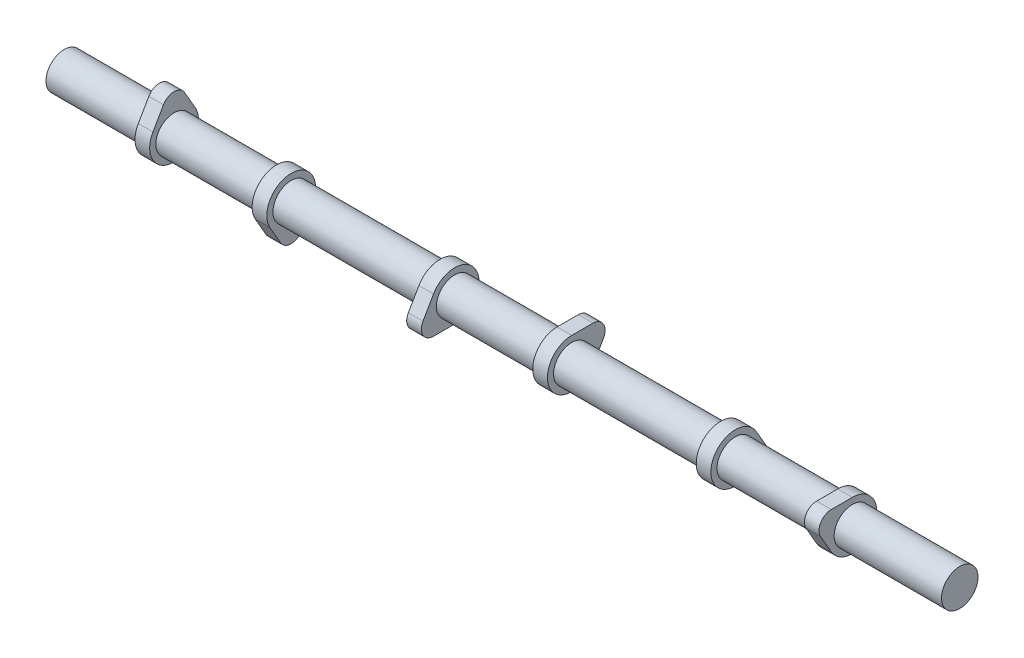
ISO-10303-21;
HEADER;
FILE_DESCRIPTION(('STEP AP214'),'2;1');
FILE_NAME('part.step','',(''),(''),'','','');
FILE_SCHEMA(('AUTOMOTIVE_DESIGN { 1 0 10303 214 1 1 1 1 }'));
ENDSEC;
DATA;
#1=APPLICATION_CONTEXT('core data for automotive mechanical design processes');
#2=APPLICATION_PROTOCOL_DEFINITION('international standard','automotive_design',2000,#1);
#3=PRODUCT_CONTEXT('',#1,'mechanical');
#4=PRODUCT('Part','Part','',(#3));
#5=PRODUCT_RELATED_PRODUCT_CATEGORY('part','',(#4));
#6=PRODUCT_DEFINITION_FORMATION('','',#4);
#7=PRODUCT_DEFINITION_CONTEXT('part definition',#1,'design');
#8=PRODUCT_DEFINITION('design','',#6,#7);
#9=PRODUCT_DEFINITION_SHAPE('','',#8);
#10=(LENGTH_UNIT() NAMED_UNIT(*) SI_UNIT(.MILLI.,.METRE.));
#11=(NAMED_UNIT(*) PLANE_ANGLE_UNIT() SI_UNIT($,.RADIAN.));
#12=(NAMED_UNIT(*) SI_UNIT($,.STERADIAN.) SOLID_ANGLE_UNIT());
#13=UNCERTAINTY_MEASURE_WITH_UNIT(LENGTH_MEASURE(1.E-05),#10,'distance_accuracy_value','');
#14=(GEOMETRIC_REPRESENTATION_CONTEXT(3) GLOBAL_UNCERTAINTY_ASSIGNED_CONTEXT((#13)) GLOBAL_UNIT_ASSIGNED_CONTEXT((#10,
#11,#12)) REPRESENTATION_CONTEXT('',''));
#15=CARTESIAN_POINT('',(0.,0.,0.));
#16=DIRECTION('',(0.,0.,1.));
#17=DIRECTION('',(1.,0.,0.));
#18=AXIS2_PLACEMENT_3D('',#15,#16,#17);
#19=CARTESIAN_POINT('',(266.7,0.,0.));
#20=DIRECTION('',(-1.,0.,0.));
#21=DIRECTION('',(0.,-0.866025403784436,-0.500000000000004));
#22=AXIS2_PLACEMENT_3D('',#19,#20,#21);
#23=CYLINDRICAL_SURFACE('',#22,9.5);
#24=CARTESIAN_POINT('',(149.86,0.,0.));
#25=DIRECTION('',(1.,0.,0.));
#26=DIRECTION('',(0.,0.866025403784436,0.500000000000004));
#27=AXIS2_PLACEMENT_3D('',#24,#25,#26);
#28=CIRCLE('',#27,9.5);
#29=CARTESIAN_POINT('',(149.86,8.22724133595215,4.75000000000004));
#30=VERTEX_POINT('',#29);
#31=EDGE_CURVE('E394',#30,#30,#28,.F.);
#32=ORIENTED_EDGE('',*,*,#31,.F.);
#33=EDGE_LOOP('',(#32));
#34=FACE_BOUND('',#33,.T.);
#35=CARTESIAN_POINT('',(203.2,0.,0.));
#36=DIRECTION('',(1.,0.,0.));
#37=DIRECTION('',(0.,0.866025403784436,0.500000000000004));
#38=AXIS2_PLACEMENT_3D('',#35,#36,#37);
#39=CIRCLE('',#38,9.5);
#40=CARTESIAN_POINT('',(203.2,8.22724133595215,4.75000000000004));
#41=VERTEX_POINT('',#40);
#42=EDGE_CURVE('E11',#41,#41,#39,.T.);
#43=ORIENTED_EDGE('',*,*,#42,.F.);
#44=EDGE_LOOP('',(#43));
#45=FACE_BOUND('',#44,.T.);
#46=ADVANCED_FACE('F41',(#34,#45),#23,.T.);
#47=CARTESIAN_POINT('',(149.86,0.,0.));
#48=DIRECTION('',(-1.,0.,0.));
#49=DIRECTION('',(0.,-0.866025403784436,-0.500000000000004));
#50=AXIS2_PLACEMENT_3D('',#47,#48,#49);
#51=CYLINDRICAL_SURFACE('',#50,12.7);
#52=CARTESIAN_POINT('',(142.24,0.,0.));
#53=DIRECTION('',(1.,0.,0.));
#54=DIRECTION('',(0.,0.866025403784436,0.500000000000004));
#55=AXIS2_PLACEMENT_3D('',#52,#53,#54);
#56=CIRCLE('',#55,12.7);
#57=CARTESIAN_POINT('',(142.24,-12.7,0.));
#58=VERTEX_POINT('',#57);
#59=CARTESIAN_POINT('',(142.24,6.34999999999995,10.9985226280624));
#60=VERTEX_POINT('',#59);
#61=EDGE_CURVE('E397',#58,#60,#56,.T.);
#62=ORIENTED_EDGE('',*,*,#61,.T.);
#63=DIRECTION('',(-1.,0.,0.));
#64=VECTOR('',#63,1.);
#65=CARTESIAN_POINT('',(149.86,6.34999999999995,10.9985226280624));
#66=LINE('',#65,#64);
#67=CARTESIAN_POINT('',(149.86,6.34999999999995,10.9985226280624));
#68=VERTEX_POINT('',#67);
#69=EDGE_CURVE('E416',#68,#60,#66,.T.);
#70=ORIENTED_EDGE('',*,*,#69,.F.);
#71=CARTESIAN_POINT('',(149.86,0.,0.));
#72=DIRECTION('',(1.,0.,0.));
#73=DIRECTION('',(0.,0.866025403784436,0.500000000000004));
#74=AXIS2_PLACEMENT_3D('',#71,#72,#73);
#75=CIRCLE('',#74,12.7);
#76=CARTESIAN_POINT('',(149.86,-12.7,0.));
#77=VERTEX_POINT('',#76);
#78=EDGE_CURVE('E398',#77,#68,#75,.T.);
#79=ORIENTED_EDGE('',*,*,#78,.F.);
#80=DIRECTION('',(-1.,0.,0.));
#81=VECTOR('',#80,1.);
#82=CARTESIAN_POINT('',(149.86,-12.7,0.));
#83=LINE('',#82,#81);
#84=EDGE_CURVE('E404',#77,#58,#83,.T.);
#85=ORIENTED_EDGE('',*,*,#84,.T.);
#86=EDGE_LOOP('',(#62,#70,#79,#85));
#87=FACE_BOUND('',#86,.T.);
#88=ADVANCED_FACE('F43',(#87),#51,.T.);
#89=CARTESIAN_POINT('',(149.86,-3.17500000000008,16.4977839420935));
#90=DIRECTION('',(0.,-0.499999999999996,-0.866025403784441));
#91=DIRECTION('',(0.,0.866025403784441,-0.499999999999996));
#92=AXIS2_PLACEMENT_3D('',#89,#90,#91);
#93=PLANE('',#92);
#94=DIRECTION('',(0.,-0.866025403784441,0.499999999999996));
#95=VECTOR('',#94,1.);
#96=CARTESIAN_POINT('',(142.24,-3.17500000000008,16.4977839420935));
#97=LINE('',#96,#95);
#98=CARTESIAN_POINT('',(142.24,-3.17500000000008,16.4977839420935));
#99=VERTEX_POINT('',#98);
#100=EDGE_CURVE('E407',#60,#99,#97,.T.);
#101=ORIENTED_EDGE('',*,*,#100,.T.);
#102=DIRECTION('',(-1.,0.,0.));
#103=VECTOR('',#102,1.);
#104=CARTESIAN_POINT('',(149.86,-3.17500000000008,16.4977839420935));
#105=LINE('',#104,#103);
#106=CARTESIAN_POINT('',(149.86,-3.17500000000008,16.4977839420935));
#107=VERTEX_POINT('',#106);
#108=EDGE_CURVE('E414',#107,#99,#105,.T.);
#109=ORIENTED_EDGE('',*,*,#108,.F.);
#110=DIRECTION('',(0.,-0.866025403784441,0.499999999999996));
#111=VECTOR('',#110,1.);
#112=CARTESIAN_POINT('',(149.86,-3.17500000000008,16.4977839420935));
#113=LINE('',#112,#111);
#114=EDGE_CURVE('E91',#68,#107,#113,.T.);
#115=ORIENTED_EDGE('',*,*,#114,.F.);
#116=ORIENTED_EDGE('',*,*,#69,.T.);
#117=EDGE_LOOP('',(#101,#109,#115,#116));
#118=FACE_BOUND('',#117,.T.);
#119=ADVANCED_FACE('F436',(#118),#93,.F.);
#120=CARTESIAN_POINT('',(149.86,-6.35000000000005,10.9985226280623));
#121=DIRECTION('',(-1.,0.,0.));
#122=DIRECTION('',(0.,-0.866025403784436,-0.500000000000004));
#123=AXIS2_PLACEMENT_3D('',#120,#121,#122);
#124=CYLINDRICAL_SURFACE('',#123,6.35);
#125=CARTESIAN_POINT('',(142.24,-6.35000000000005,10.9985226280623));
#126=DIRECTION('',(1.,0.,0.));
#127=DIRECTION('',(0.,0.866025403784436,0.500000000000004));
#128=AXIS2_PLACEMENT_3D('',#125,#126,#127);
#129=CIRCLE('',#128,6.35);
#130=CARTESIAN_POINT('',(142.24,-12.7000000000001,10.9985226280623));
#131=VERTEX_POINT('',#130);
#132=EDGE_CURVE('E77',#99,#131,#129,.T.);
#133=ORIENTED_EDGE('',*,*,#132,.T.);
#134=DIRECTION('',(-1.,0.,0.));
#135=VECTOR('',#134,1.);
#136=CARTESIAN_POINT('',(149.86,-12.7000000000001,10.9985226280623));
#137=LINE('',#136,#135);
#138=CARTESIAN_POINT('',(149.86,-12.7000000000001,10.9985226280623));
#139=VERTEX_POINT('',#138);
#140=EDGE_CURVE('E412',#139,#131,#137,.T.);
#141=ORIENTED_EDGE('',*,*,#140,.F.);
#142=CARTESIAN_POINT('',(149.86,-6.35000000000005,10.9985226280623));
#143=DIRECTION('',(1.,0.,0.));
#144=DIRECTION('',(0.,0.866025403784436,0.500000000000004));
#145=AXIS2_PLACEMENT_3D('',#142,#143,#144);
#146=CIRCLE('',#145,6.35);
#147=EDGE_CURVE('E401',#107,#139,#146,.T.);
#148=ORIENTED_EDGE('',*,*,#147,.F.);
#149=ORIENTED_EDGE('',*,*,#108,.T.);
#150=EDGE_LOOP('',(#133,#141,#148,#149));
#151=FACE_BOUND('',#150,.T.);
#152=ADVANCED_FACE('F435',(#151),#124,.T.);
#153=CARTESIAN_POINT('',(149.86,-12.7,0.));
#154=DIRECTION('',(0.,1.,0.));
#155=DIRECTION('',(0.,0.,1.));
#156=AXIS2_PLACEMENT_3D('',#153,#154,#155);
#157=PLANE('',#156);
#158=DIRECTION('',(0.,0.,-1.));
#159=VECTOR('',#158,1.);
#160=CARTESIAN_POINT('',(142.24,-12.7,0.));
#161=LINE('',#160,#159);
#162=EDGE_CURVE('E83',#131,#58,#161,.T.);
#163=ORIENTED_EDGE('',*,*,#162,.T.);
#164=ORIENTED_EDGE('',*,*,#84,.F.);
#165=DIRECTION('',(0.,0.,-1.));
#166=VECTOR('',#165,1.);
#167=CARTESIAN_POINT('',(149.86,-12.7,0.));
#168=LINE('',#167,#166);
#169=EDGE_CURVE('E59',#139,#77,#168,.T.);
#170=ORIENTED_EDGE('',*,*,#169,.F.);
#171=ORIENTED_EDGE('',*,*,#140,.T.);
#172=EDGE_LOOP('',(#163,#164,#170,#171));
#173=FACE_BOUND('',#172,.T.);
#174=ADVANCED_FACE('F433',(#173),#157,.F.);
#175=CARTESIAN_POINT('',(149.86,0.,0.));
#176=DIRECTION('',(1.,0.,0.));
#177=DIRECTION('',(0.,0.866025403784436,0.500000000000004));
#178=AXIS2_PLACEMENT_3D('',#175,#176,#177);
#179=PLANE('',#178);
#180=ORIENTED_EDGE('',*,*,#31,.T.);
#181=EDGE_LOOP('',(#180));
#182=FACE_BOUND('',#181,.T.);
#183=ORIENTED_EDGE('',*,*,#78,.T.);
#184=ORIENTED_EDGE('',*,*,#114,.T.);
#185=ORIENTED_EDGE('',*,*,#147,.T.);
#186=ORIENTED_EDGE('',*,*,#169,.T.);
#187=EDGE_LOOP('',(#183,#184,#185,#186));
#188=FACE_BOUND('',#187,.T.);
#189=ADVANCED_FACE('F427',(#182,#188),#179,.T.);
#190=CARTESIAN_POINT('',(142.24,0.,0.));
#191=DIRECTION('',(1.,0.,0.));
#192=DIRECTION('',(0.,0.866025403784436,0.500000000000004));
#193=AXIS2_PLACEMENT_3D('',#190,#191,#192);
#194=PLANE('',#193);
#195=CARTESIAN_POINT('',(142.24,0.,0.));
#196=DIRECTION('',(1.,0.,0.));
#197=DIRECTION('',(0.,0.866025403784436,0.500000000000004));
#198=AXIS2_PLACEMENT_3D('',#195,#196,#197);
#199=CIRCLE('',#198,9.5);
#200=CARTESIAN_POINT('',(142.24,8.22724133595215,4.75000000000004));
#201=VERTEX_POINT('',#200);
#202=EDGE_CURVE('E51',#201,#201,#199,.F.);
#203=ORIENTED_EDGE('',*,*,#202,.F.);
#204=EDGE_LOOP('',(#203));
#205=FACE_BOUND('',#204,.T.);
#206=ORIENTED_EDGE('',*,*,#61,.F.);
#207=ORIENTED_EDGE('',*,*,#162,.F.);
#208=ORIENTED_EDGE('',*,*,#132,.F.);
#209=ORIENTED_EDGE('',*,*,#100,.F.);
#210=EDGE_LOOP('',(#206,#207,#208,#209));
#211=FACE_BOUND('',#210,.T.);
#212=ADVANCED_FACE('F424',(#205,#211),#194,.F.);
#213=ORIENTED_EDGE('',*,*,#202,.T.);
#214=EDGE_LOOP('',(#213));
#215=FACE_BOUND('',#214,.T.);
#216=CARTESIAN_POINT('',(64.77,0.,0.));
#217=DIRECTION('',(1.,0.,0.));
#218=DIRECTION('',(0.,0.,-1.));
#219=AXIS2_PLACEMENT_3D('',#216,#217,#218);
#220=CIRCLE('',#219,9.5);
#221=CARTESIAN_POINT('',(64.77,0.,-9.5));
#222=VERTEX_POINT('',#221);
#223=EDGE_CURVE('E322',#222,#222,#220,.T.);
#224=ORIENTED_EDGE('',*,*,#223,.T.);
#225=EDGE_LOOP('',(#224));
#226=FACE_BOUND('',#225,.T.);
#227=ADVANCED_FACE('F421',(#215,#226),#23,.T.);
#228=CARTESIAN_POINT('',(210.82,0.,0.));
#229=DIRECTION('',(-1.,0.,0.));
#230=DIRECTION('',(0.,0.86602540378444,0.499999999999998));
#231=AXIS2_PLACEMENT_3D('',#228,#229,#230);
#232=CYLINDRICAL_SURFACE('',#231,12.7);
#233=CARTESIAN_POINT('',(203.2,0.,0.));
#234=DIRECTION('',(1.,0.,0.));
#235=DIRECTION('',(0.,-0.86602540378444,-0.499999999999998));
#236=AXIS2_PLACEMENT_3D('',#233,#234,#235);
#237=CIRCLE('',#236,12.7);
#238=CARTESIAN_POINT('',(203.2,12.7,0.));
#239=VERTEX_POINT('',#238);
#240=CARTESIAN_POINT('',(203.2,-6.35000000000003,-10.9985226280624));
#241=VERTEX_POINT('',#240);
#242=EDGE_CURVE('E362',#239,#241,#237,.T.);
#243=ORIENTED_EDGE('',*,*,#242,.T.);
#244=DIRECTION('',(-1.,0.,0.));
#245=VECTOR('',#244,1.);
#246=CARTESIAN_POINT('',(210.82,-6.35000000000003,-10.9985226280624));
#247=LINE('',#246,#245);
#248=CARTESIAN_POINT('',(210.82,-6.35000000000003,-10.9985226280624));
#249=VERTEX_POINT('',#248);
#250=EDGE_CURVE('E391',#249,#241,#247,.T.);
#251=ORIENTED_EDGE('',*,*,#250,.F.);
#252=CARTESIAN_POINT('',(210.82,0.,0.));
#253=DIRECTION('',(1.,0.,0.));
#254=DIRECTION('',(0.,-0.86602540378444,-0.499999999999998));
#255=AXIS2_PLACEMENT_3D('',#252,#253,#254);
#256=CIRCLE('',#255,12.7);
#257=CARTESIAN_POINT('',(210.82,12.7,0.));
#258=VERTEX_POINT('',#257);
#259=EDGE_CURVE('E365',#258,#249,#256,.T.);
#260=ORIENTED_EDGE('',*,*,#259,.F.);
#261=DIRECTION('',(-1.,0.,0.));
#262=VECTOR('',#261,1.);
#263=CARTESIAN_POINT('',(210.82,12.7,0.));
#264=LINE('',#263,#262);
#265=EDGE_CURVE('E375',#258,#239,#264,.T.);
#266=ORIENTED_EDGE('',*,*,#265,.T.);
#267=EDGE_LOOP('',(#243,#251,#260,#266));
#268=FACE_BOUND('',#267,.T.);
#269=ADVANCED_FACE('F454',(#268),#232,.T.);
#270=CARTESIAN_POINT('',(210.82,3.17499999999996,-16.4977839420936));
#271=DIRECTION('',(0.,0.500000000000002,0.866025403784438));
#272=DIRECTION('',(0.,-0.866025403784438,0.500000000000002));
#273=AXIS2_PLACEMENT_3D('',#270,#271,#272);
#274=PLANE('',#273);
#275=DIRECTION('',(0.,0.866025403784438,-0.500000000000002));
#276=VECTOR('',#275,1.);
#277=CARTESIAN_POINT('',(203.2,3.17499999999996,-16.4977839420936));
#278=LINE('',#277,#276);
#279=CARTESIAN_POINT('',(203.2,3.17499999999996,-16.4977839420936));
#280=VERTEX_POINT('',#279);
#281=EDGE_CURVE('E378',#241,#280,#278,.T.);
#282=ORIENTED_EDGE('',*,*,#281,.T.);
#283=DIRECTION('',(-1.,0.,0.));
#284=VECTOR('',#283,1.);
#285=CARTESIAN_POINT('',(210.82,3.17499999999996,-16.4977839420936));
#286=LINE('',#285,#284);
#287=CARTESIAN_POINT('',(210.82,3.17499999999996,-16.4977839420936));
#288=VERTEX_POINT('',#287);
#289=EDGE_CURVE('E388',#288,#280,#286,.T.);
#290=ORIENTED_EDGE('',*,*,#289,.F.);
#291=DIRECTION('',(0.,0.866025403784438,-0.500000000000002));
#292=VECTOR('',#291,1.);
#293=CARTESIAN_POINT('',(210.82,3.17499999999996,-16.4977839420936));
#294=LINE('',#293,#292);
#295=EDGE_CURVE('E368',#249,#288,#294,.T.);
#296=ORIENTED_EDGE('',*,*,#295,.F.);
#297=ORIENTED_EDGE('',*,*,#250,.T.);
#298=EDGE_LOOP('',(#282,#290,#296,#297));
#299=FACE_BOUND('',#298,.T.);
#300=ADVANCED_FACE('F578',(#299),#274,.F.);
#301=CARTESIAN_POINT('',(210.82,6.34999999999997,-10.9985226280624));
#302=DIRECTION('',(-1.,0.,0.));
#303=DIRECTION('',(0.,0.86602540378444,0.499999999999998));
#304=AXIS2_PLACEMENT_3D('',#301,#302,#303);
#305=CYLINDRICAL_SURFACE('',#304,6.35);
#306=CARTESIAN_POINT('',(203.2,6.34999999999997,-10.9985226280624));
#307=DIRECTION('',(1.,0.,0.));
#308=DIRECTION('',(0.,-0.86602540378444,-0.499999999999998));
#309=AXIS2_PLACEMENT_3D('',#306,#307,#308);
#310=CIRCLE('',#309,6.35);
#311=CARTESIAN_POINT('',(203.2,12.7,-10.9985226280624));
#312=VERTEX_POINT('',#311);
#313=EDGE_CURVE('E380',#280,#312,#310,.T.);
#314=ORIENTED_EDGE('',*,*,#313,.T.);
#315=DIRECTION('',(-1.,0.,0.));
#316=VECTOR('',#315,1.);
#317=CARTESIAN_POINT('',(210.82,12.7,-10.9985226280624));
#318=LINE('',#317,#316);
#319=CARTESIAN_POINT('',(210.82,12.7,-10.9985226280624));
#320=VERTEX_POINT('',#319);
#321=EDGE_CURVE('E385',#320,#312,#318,.T.);
#322=ORIENTED_EDGE('',*,*,#321,.F.);
#323=CARTESIAN_POINT('',(210.82,6.34999999999997,-10.9985226280624));
#324=DIRECTION('',(1.,0.,0.));
#325=DIRECTION('',(0.,-0.86602540378444,-0.499999999999998));
#326=AXIS2_PLACEMENT_3D('',#323,#324,#325);
#327=CIRCLE('',#326,6.35);
#328=EDGE_CURVE('E371',#288,#320,#327,.T.);
#329=ORIENTED_EDGE('',*,*,#328,.F.);
#330=ORIENTED_EDGE('',*,*,#289,.T.);
#331=EDGE_LOOP('',(#314,#322,#329,#330));
#332=FACE_BOUND('',#331,.T.);
#333=ADVANCED_FACE('F574',(#332),#305,.T.);
#334=CARTESIAN_POINT('',(210.82,12.7,0.));
#335=DIRECTION('',(0.,-1.,0.));
#336=DIRECTION('',(0.,0.,-1.));
#337=AXIS2_PLACEMENT_3D('',#334,#335,#336);
#338=PLANE('',#337);
#339=DIRECTION('',(0.,0.,1.));
#340=VECTOR('',#339,1.);
#341=CARTESIAN_POINT('',(203.2,12.7,0.));
#342=LINE('',#341,#340);
#343=EDGE_CURVE('E369',#312,#239,#342,.T.);
#344=ORIENTED_EDGE('',*,*,#343,.T.);
#345=ORIENTED_EDGE('',*,*,#265,.F.);
#346=DIRECTION('',(0.,0.,1.));
#347=VECTOR('',#346,1.);
#348=CARTESIAN_POINT('',(210.82,12.7,0.));
#349=LINE('',#348,#347);
#350=EDGE_CURVE('E373',#320,#258,#349,.T.);
#351=ORIENTED_EDGE('',*,*,#350,.F.);
#352=ORIENTED_EDGE('',*,*,#321,.T.);
#353=EDGE_LOOP('',(#344,#345,#351,#352));
#354=FACE_BOUND('',#353,.T.);
#355=ADVANCED_FACE('F569',(#354),#338,.F.);
#356=CARTESIAN_POINT('',(210.82,0.,0.));
#357=DIRECTION('',(1.,0.,0.));
#358=DIRECTION('',(0.,-0.86602540378444,-0.499999999999998));
#359=AXIS2_PLACEMENT_3D('',#356,#357,#358);
#360=PLANE('',#359);
#361=CARTESIAN_POINT('',(210.82,0.,0.));
#362=DIRECTION('',(1.,0.,0.));
#363=DIRECTION('',(0.,0.866025403784436,0.500000000000004));
#364=AXIS2_PLACEMENT_3D('',#361,#362,#363);
#365=CIRCLE('',#364,9.5);
#366=CARTESIAN_POINT('',(210.82,8.22724133595215,4.75000000000004));
#367=VERTEX_POINT('',#366);
#368=EDGE_CURVE('E45',#367,#367,#365,.T.);
#369=ORIENTED_EDGE('',*,*,#368,.F.);
#370=EDGE_LOOP('',(#369));
#371=FACE_BOUND('',#370,.T.);
#372=ORIENTED_EDGE('',*,*,#259,.T.);
#373=ORIENTED_EDGE('',*,*,#295,.T.);
#374=ORIENTED_EDGE('',*,*,#328,.T.);
#375=ORIENTED_EDGE('',*,*,#350,.T.);
#376=EDGE_LOOP('',(#372,#373,#374,#375));
#377=FACE_BOUND('',#376,.T.);
#378=ADVANCED_FACE('F467',(#371,#377),#360,.T.);
#379=CARTESIAN_POINT('',(203.2,0.,0.));
#380=DIRECTION('',(1.,0.,0.));
#381=DIRECTION('',(0.,-0.86602540378444,-0.499999999999998));
#382=AXIS2_PLACEMENT_3D('',#379,#380,#381);
#383=PLANE('',#382);
#384=ORIENTED_EDGE('',*,*,#42,.T.);
#385=EDGE_LOOP('',(#384));
#386=FACE_BOUND('',#385,.T.);
#387=ORIENTED_EDGE('',*,*,#242,.F.);
#388=ORIENTED_EDGE('',*,*,#343,.F.);
#389=ORIENTED_EDGE('',*,*,#313,.F.);
#390=ORIENTED_EDGE('',*,*,#281,.F.);
#391=EDGE_LOOP('',(#387,#388,#389,#390));
#392=FACE_BOUND('',#391,.T.);
#393=ADVANCED_FACE('F457',(#386,#392),#383,.F.);
#394=ORIENTED_EDGE('',*,*,#368,.T.);
#395=EDGE_LOOP('',(#394));
#396=FACE_BOUND('',#395,.T.);
#397=CARTESIAN_POINT('',(288.29,0.,0.));
#398=DIRECTION('',(1.,0.,0.));
#399=DIRECTION('',(0.,-0.866025403784443,0.499999999999992));
#400=AXIS2_PLACEMENT_3D('',#397,#398,#399);
#401=CIRCLE('',#400,9.5);
#402=CARTESIAN_POINT('',(288.29,-8.22724133595221,4.74999999999992));
#403=VERTEX_POINT('',#402);
#404=EDGE_CURVE('E283',#403,#403,#401,.F.);
#405=ORIENTED_EDGE('',*,*,#404,.T.);
#406=EDGE_LOOP('',(#405));
#407=FACE_BOUND('',#406,.T.);
#408=ADVANCED_FACE('F446',(#396,#407),#23,.T.);
#409=CARTESIAN_POINT('',(120.65,0.,0.));
#410=DIRECTION('',(-1.,0.,0.));
#411=DIRECTION('',(0.,0.,1.));
#412=AXIS2_PLACEMENT_3D('',#409,#410,#411);
#413=CYLINDRICAL_SURFACE('',#412,9.5);
#414=CARTESIAN_POINT('',(3.80999999999999,0.,0.));
#415=DIRECTION('',(1.,0.,0.));
#416=DIRECTION('',(0.,0.,-1.));
#417=AXIS2_PLACEMENT_3D('',#414,#415,#416);
#418=CIRCLE('',#417,9.5);
#419=CARTESIAN_POINT('',(3.80999999999999,0.,-9.5));
#420=VERTEX_POINT('',#419);
#421=EDGE_CURVE('E323',#420,#420,#418,.F.);
#422=ORIENTED_EDGE('',*,*,#421,.F.);
#423=EDGE_LOOP('',(#422));
#424=FACE_BOUND('',#423,.T.);
#425=CARTESIAN_POINT('',(57.15,0.,0.));
#426=DIRECTION('',(1.,0.,0.));
#427=DIRECTION('',(0.,0.,-1.));
#428=AXIS2_PLACEMENT_3D('',#425,#426,#427);
#429=CIRCLE('',#428,9.5);
#430=CARTESIAN_POINT('',(57.15,0.,-9.5));
#431=VERTEX_POINT('',#430);
#432=EDGE_CURVE('E359',#431,#431,#429,.T.);
#433=ORIENTED_EDGE('',*,*,#432,.F.);
#434=EDGE_LOOP('',(#433));
#435=FACE_BOUND('',#434,.T.);
#436=ADVANCED_FACE('F456',(#424,#435),#413,.T.);
#437=CARTESIAN_POINT('',(3.81,0.,0.));
#438=DIRECTION('',(-1.,0.,0.));
#439=DIRECTION('',(0.,0.,1.));
#440=AXIS2_PLACEMENT_3D('',#437,#438,#439);
#441=CYLINDRICAL_SURFACE('',#440,12.7);
#442=CARTESIAN_POINT('',(-3.81,0.,0.));
#443=DIRECTION('',(1.,0.,0.));
#444=DIRECTION('',(0.,0.,-1.));
#445=AXIS2_PLACEMENT_3D('',#442,#443,#444);
#446=CIRCLE('',#445,12.7);
#447=CARTESIAN_POINT('',(-3.81,6.35,10.9985226280624));
#448=VERTEX_POINT('',#447);
#449=CARTESIAN_POINT('',(-3.81,6.35,-10.9985226280624));
#450=VERTEX_POINT('',#449);
#451=EDGE_CURVE('E326',#448,#450,#446,.T.);
#452=ORIENTED_EDGE('',*,*,#451,.T.);
#453=DIRECTION('',(-1.,0.,0.));
#454=VECTOR('',#453,1.);
#455=CARTESIAN_POINT('',(3.81,6.35,-10.9985226280624));
#456=LINE('',#455,#454);
#457=CARTESIAN_POINT('',(3.81,6.35,-10.9985226280624));
#458=VERTEX_POINT('',#457);
#459=EDGE_CURVE('E353',#458,#450,#456,.T.);
#460=ORIENTED_EDGE('',*,*,#459,.F.);
#461=CARTESIAN_POINT('',(3.81,0.,0.));
#462=DIRECTION('',(1.,0.,0.));
#463=DIRECTION('',(0.,0.,-1.));
#464=AXIS2_PLACEMENT_3D('',#461,#462,#463);
#465=CIRCLE('',#464,12.7);
#466=CARTESIAN_POINT('',(3.81,6.35,10.9985226280624));
#467=VERTEX_POINT('',#466);
#468=EDGE_CURVE('E327',#467,#458,#465,.T.);
#469=ORIENTED_EDGE('',*,*,#468,.F.);
#470=DIRECTION('',(-1.,0.,0.));
#471=VECTOR('',#470,1.);
#472=CARTESIAN_POINT('',(3.81,6.35,10.9985226280624));
#473=LINE('',#472,#471);
#474=EDGE_CURVE('E337',#467,#448,#473,.T.);
#475=ORIENTED_EDGE('',*,*,#474,.T.);
#476=EDGE_LOOP('',(#452,#460,#469,#475));
#477=FACE_BOUND('',#476,.T.);
#478=ADVANCED_FACE('F463',(#477),#441,.T.);
#479=CARTESIAN_POINT('',(3.81,15.875,-5.49926131403118));
#480=DIRECTION('',(0.,-0.5,0.866025403784438));
#481=DIRECTION('',(0.,-0.866025403784439,-0.5));
#482=AXIS2_PLACEMENT_3D('',#479,#480,#481);
#483=PLANE('',#482);
#484=DIRECTION('',(0.,0.866025403784439,0.5));
#485=VECTOR('',#484,1.);
#486=CARTESIAN_POINT('',(-3.81,15.875,-5.49926131403118));
#487=LINE('',#486,#485);
#488=CARTESIAN_POINT('',(-3.81,15.875,-5.49926131403118));
#489=VERTEX_POINT('',#488);
#490=EDGE_CURVE('E340',#450,#489,#487,.T.);
#491=ORIENTED_EDGE('',*,*,#490,.T.);
#492=DIRECTION('',(-1.,0.,0.));
#493=VECTOR('',#492,1.);
#494=CARTESIAN_POINT('',(3.81,15.875,-5.49926131403118));
#495=LINE('',#494,#493);
#496=CARTESIAN_POINT('',(3.81,15.875,-5.49926131403118));
#497=VERTEX_POINT('',#496);
#498=EDGE_CURVE('E350',#497,#489,#495,.T.);
#499=ORIENTED_EDGE('',*,*,#498,.F.);
#500=DIRECTION('',(0.,0.866025403784439,0.5));
#501=VECTOR('',#500,1.);
#502=CARTESIAN_POINT('',(3.81,15.875,-5.49926131403118));
#503=LINE('',#502,#501);
#504=EDGE_CURVE('E330',#458,#497,#503,.T.);
#505=ORIENTED_EDGE('',*,*,#504,.F.);
#506=ORIENTED_EDGE('',*,*,#459,.T.);
#507=EDGE_LOOP('',(#491,#499,#505,#506));
#508=FACE_BOUND('',#507,.T.);
#509=ADVANCED_FACE('F560',(#508),#483,.F.);
#510=CARTESIAN_POINT('',(3.81,12.7,0.));
#511=DIRECTION('',(-1.,0.,0.));
#512=DIRECTION('',(0.,0.,1.));
#513=AXIS2_PLACEMENT_3D('',#510,#511,#512);
#514=CYLINDRICAL_SURFACE('',#513,6.35);
#515=CARTESIAN_POINT('',(-3.81,12.7,0.));
#516=DIRECTION('',(1.,0.,0.));
#517=DIRECTION('',(0.,0.,-1.));
#518=AXIS2_PLACEMENT_3D('',#515,#516,#517);
#519=CIRCLE('',#518,6.35);
#520=CARTESIAN_POINT('',(-3.81,15.875,5.49926131403118));
#521=VERTEX_POINT('',#520);
#522=EDGE_CURVE('E342',#489,#521,#519,.T.);
#523=ORIENTED_EDGE('',*,*,#522,.T.);
#524=DIRECTION('',(-1.,0.,0.));
#525=VECTOR('',#524,1.);
#526=CARTESIAN_POINT('',(3.81,15.875,5.49926131403118));
#527=LINE('',#526,#525);
#528=CARTESIAN_POINT('',(3.81,15.875,5.49926131403118));
#529=VERTEX_POINT('',#528);
#530=EDGE_CURVE('E347',#529,#521,#527,.T.);
#531=ORIENTED_EDGE('',*,*,#530,.F.);
#532=CARTESIAN_POINT('',(3.81,12.7,0.));
#533=DIRECTION('',(1.,0.,0.));
#534=DIRECTION('',(0.,0.,-1.));
#535=AXIS2_PLACEMENT_3D('',#532,#533,#534);
#536=CIRCLE('',#535,6.35);
#537=EDGE_CURVE('E333',#497,#529,#536,.T.);
#538=ORIENTED_EDGE('',*,*,#537,.F.);
#539=ORIENTED_EDGE('',*,*,#498,.T.);
#540=EDGE_LOOP('',(#523,#531,#538,#539));
#541=FACE_BOUND('',#540,.T.);
#542=ADVANCED_FACE('F556',(#541),#514,.T.);
#543=CARTESIAN_POINT('',(3.81,6.35,10.9985226280624));
#544=DIRECTION('',(0.,-0.5,-0.866025403784439));
#545=DIRECTION('',(0.,0.866025403784439,-0.5));
#546=AXIS2_PLACEMENT_3D('',#543,#544,#545);
#547=PLANE('',#546);
#548=DIRECTION('',(0.,-0.866025403784439,0.5));
#549=VECTOR('',#548,1.);
#550=CARTESIAN_POINT('',(-3.81,6.35,10.9985226280624));
#551=LINE('',#550,#549);
#552=EDGE_CURVE('E331',#521,#448,#551,.T.);
#553=ORIENTED_EDGE('',*,*,#552,.T.);
#554=ORIENTED_EDGE('',*,*,#474,.F.);
#555=DIRECTION('',(0.,-0.866025403784439,0.5));
#556=VECTOR('',#555,1.);
#557=CARTESIAN_POINT('',(3.81,6.35,10.9985226280624));
#558=LINE('',#557,#556);
#559=EDGE_CURVE('E335',#529,#467,#558,.T.);
#560=ORIENTED_EDGE('',*,*,#559,.F.);
#561=ORIENTED_EDGE('',*,*,#530,.T.);
#562=EDGE_LOOP('',(#553,#554,#560,#561));
#563=FACE_BOUND('',#562,.T.);
#564=ADVANCED_FACE('F549',(#563),#547,.F.);
#565=CARTESIAN_POINT('',(3.81,0.,0.));
#566=DIRECTION('',(1.,0.,0.));
#567=DIRECTION('',(0.,0.,-1.));
#568=AXIS2_PLACEMENT_3D('',#565,#566,#567);
#569=PLANE('',#568);
#570=ORIENTED_EDGE('',*,*,#421,.T.);
#571=EDGE_LOOP('',(#570));
#572=FACE_BOUND('',#571,.T.);
#573=ORIENTED_EDGE('',*,*,#468,.T.);
#574=ORIENTED_EDGE('',*,*,#504,.T.);
#575=ORIENTED_EDGE('',*,*,#537,.T.);
#576=ORIENTED_EDGE('',*,*,#559,.T.);
#577=EDGE_LOOP('',(#573,#574,#575,#576));
#578=FACE_BOUND('',#577,.T.);
#579=ADVANCED_FACE('F545',(#572,#578),#569,.T.);
#580=CARTESIAN_POINT('',(-3.81,0.,0.));
#581=DIRECTION('',(1.,0.,0.));
#582=DIRECTION('',(0.,0.,-1.));
#583=AXIS2_PLACEMENT_3D('',#580,#581,#582);
#584=PLANE('',#583);
#585=CARTESIAN_POINT('',(-3.80999999999999,0.,0.));
#586=DIRECTION('',(1.,0.,0.));
#587=DIRECTION('',(0.,0.,-1.));
#588=AXIS2_PLACEMENT_3D('',#585,#586,#587);
#589=CIRCLE('',#588,9.5);
#590=CARTESIAN_POINT('',(-3.80999999999999,0.,-9.5));
#591=VERTEX_POINT('',#590);
#592=EDGE_CURVE('E356',#591,#591,#589,.F.);
#593=ORIENTED_EDGE('',*,*,#592,.F.);
#594=EDGE_LOOP('',(#593));
#595=FACE_BOUND('',#594,.T.);
#596=ORIENTED_EDGE('',*,*,#451,.F.);
#597=ORIENTED_EDGE('',*,*,#552,.F.);
#598=ORIENTED_EDGE('',*,*,#522,.F.);
#599=ORIENTED_EDGE('',*,*,#490,.F.);
#600=EDGE_LOOP('',(#596,#597,#598,#599));
#601=FACE_BOUND('',#600,.T.);
#602=ADVANCED_FACE('F548',(#595,#601),#584,.F.);
#603=ORIENTED_EDGE('',*,*,#592,.T.);
#604=EDGE_LOOP('',(#603));
#605=FACE_BOUND('',#604,.T.);
#606=CARTESIAN_POINT('',(-53.34,0.,0.));
#607=DIRECTION('',(-1.,0.,0.));
#608=DIRECTION('',(0.,0.,1.));
#609=AXIS2_PLACEMENT_3D('',#606,#607,#608);
#610=CIRCLE('',#609,9.5);
#611=CARTESIAN_POINT('',(-53.34,0.,9.5));
#612=VERTEX_POINT('',#611);
#613=EDGE_CURVE('E288',#612,#612,#610,.T.);
#614=ORIENTED_EDGE('',*,*,#613,.F.);
#615=EDGE_LOOP('',(#614));
#616=FACE_BOUND('',#615,.T.);
#617=ADVANCED_FACE('F466',(#605,#616),#413,.T.);
#618=CARTESIAN_POINT('',(64.77,0.,0.));
#619=DIRECTION('',(-1.,0.,0.));
#620=DIRECTION('',(0.,0.,-1.));
#621=AXIS2_PLACEMENT_3D('',#618,#619,#620);
#622=CYLINDRICAL_SURFACE('',#621,12.7);
#623=CARTESIAN_POINT('',(57.15,0.,0.));
#624=DIRECTION('',(1.,0.,0.));
#625=DIRECTION('',(0.,0.,1.));
#626=AXIS2_PLACEMENT_3D('',#623,#624,#625);
#627=CIRCLE('',#626,12.7);
#628=CARTESIAN_POINT('',(57.15,-6.35000000000008,-10.9985226280623));
#629=VERTEX_POINT('',#628);
#630=CARTESIAN_POINT('',(57.15,-6.34999999999992,10.9985226280624));
#631=VERTEX_POINT('',#630);
#632=EDGE_CURVE('E292',#629,#631,#627,.T.);
#633=ORIENTED_EDGE('',*,*,#632,.T.);
#634=DIRECTION('',(-1.,0.,0.));
#635=VECTOR('',#634,1.);
#636=CARTESIAN_POINT('',(64.77,-6.34999999999992,10.9985226280624));
#637=LINE('',#636,#635);
#638=CARTESIAN_POINT('',(64.77,-6.34999999999992,10.9985226280624));
#639=VERTEX_POINT('',#638);
#640=EDGE_CURVE('E319',#639,#631,#637,.T.);
#641=ORIENTED_EDGE('',*,*,#640,.F.);
#642=CARTESIAN_POINT('',(64.77,0.,0.));
#643=DIRECTION('',(1.,0.,0.));
#644=DIRECTION('',(0.,0.,1.));
#645=AXIS2_PLACEMENT_3D('',#642,#643,#644);
#646=CIRCLE('',#645,12.7);
#647=CARTESIAN_POINT('',(64.77,-6.35000000000008,-10.9985226280623));
#648=VERTEX_POINT('',#647);
#649=EDGE_CURVE('E293',#648,#639,#646,.T.);
#650=ORIENTED_EDGE('',*,*,#649,.F.);
#651=DIRECTION('',(-1.,0.,0.));
#652=VECTOR('',#651,1.);
#653=CARTESIAN_POINT('',(64.77,-6.35000000000008,-10.9985226280623));
#654=LINE('',#653,#652);
#655=EDGE_CURVE('E303',#648,#629,#654,.T.);
#656=ORIENTED_EDGE('',*,*,#655,.T.);
#657=EDGE_LOOP('',(#633,#641,#650,#656));
#658=FACE_BOUND('',#657,.T.);
#659=ADVANCED_FACE('F540',(#658),#622,.T.);
#660=CARTESIAN_POINT('',(64.77,-15.875,5.49926131403129));
#661=DIRECTION('',(0.,0.499999999999994,-0.866025403784442));
#662=DIRECTION('',(0.,0.866025403784442,0.499999999999994));
#663=AXIS2_PLACEMENT_3D('',#660,#661,#662);
#664=PLANE('',#663);
#665=DIRECTION('',(0.,-0.866025403784442,-0.499999999999994));
#666=VECTOR('',#665,1.);
#667=CARTESIAN_POINT('',(57.15,-15.875,5.49926131403129));
#668=LINE('',#667,#666);
#669=CARTESIAN_POINT('',(57.15,-15.875,5.49926131403129));
#670=VERTEX_POINT('',#669);
#671=EDGE_CURVE('E306',#631,#670,#668,.T.);
#672=ORIENTED_EDGE('',*,*,#671,.T.);
#673=DIRECTION('',(-1.,0.,0.));
#674=VECTOR('',#673,1.);
#675=CARTESIAN_POINT('',(64.77,-15.875,5.49926131403129));
#676=LINE('',#675,#674);
#677=CARTESIAN_POINT('',(64.77,-15.875,5.49926131403129));
#678=VERTEX_POINT('',#677);
#679=EDGE_CURVE('E316',#678,#670,#676,.T.);
#680=ORIENTED_EDGE('',*,*,#679,.F.);
#681=DIRECTION('',(0.,-0.866025403784442,-0.499999999999994));
#682=VECTOR('',#681,1.);
#683=CARTESIAN_POINT('',(64.77,-15.875,5.49926131403129));
#684=LINE('',#683,#682);
#685=EDGE_CURVE('E296',#639,#678,#684,.T.);
#686=ORIENTED_EDGE('',*,*,#685,.F.);
#687=ORIENTED_EDGE('',*,*,#640,.T.);
#688=EDGE_LOOP('',(#672,#680,#686,#687));
#689=FACE_BOUND('',#688,.T.);
#690=ADVANCED_FACE('F536',(#689),#664,.F.);
#691=CARTESIAN_POINT('',(64.77,-12.7,0.));
#692=DIRECTION('',(-1.,0.,0.));
#693=DIRECTION('',(0.,0.,-1.));
#694=AXIS2_PLACEMENT_3D('',#691,#692,#693);
#695=CYLINDRICAL_SURFACE('',#694,6.35);
#696=CARTESIAN_POINT('',(57.15,-12.7,0.));
#697=DIRECTION('',(1.,0.,0.));
#698=DIRECTION('',(0.,0.,1.));
#699=AXIS2_PLACEMENT_3D('',#696,#697,#698);
#700=CIRCLE('',#699,6.35);
#701=CARTESIAN_POINT('',(57.15,-15.875,-5.49926131403107));
#702=VERTEX_POINT('',#701);
#703=EDGE_CURVE('E308',#670,#702,#700,.T.);
#704=ORIENTED_EDGE('',*,*,#703,.T.);
#705=DIRECTION('',(-1.,0.,0.));
#706=VECTOR('',#705,1.);
#707=CARTESIAN_POINT('',(64.77,-15.875,-5.49926131403107));
#708=LINE('',#707,#706);
#709=CARTESIAN_POINT('',(64.77,-15.875,-5.49926131403107));
#710=VERTEX_POINT('',#709);
#711=EDGE_CURVE('E313',#710,#702,#708,.T.);
#712=ORIENTED_EDGE('',*,*,#711,.F.);
#713=CARTESIAN_POINT('',(64.77,-12.7,0.));
#714=DIRECTION('',(1.,0.,0.));
#715=DIRECTION('',(0.,0.,1.));
#716=AXIS2_PLACEMENT_3D('',#713,#714,#715);
#717=CIRCLE('',#716,6.35);
#718=EDGE_CURVE('E299',#678,#710,#717,.T.);
#719=ORIENTED_EDGE('',*,*,#718,.F.);
#720=ORIENTED_EDGE('',*,*,#679,.T.);
#721=EDGE_LOOP('',(#704,#712,#719,#720));
#722=FACE_BOUND('',#721,.T.);
#723=ADVANCED_FACE('F532',(#722),#695,.T.);
#724=CARTESIAN_POINT('',(64.77,-6.35000000000008,-10.9985226280623));
#725=DIRECTION('',(0.,0.500000000000006,0.866025403784435));
#726=DIRECTION('',(0.,-0.866025403784435,0.500000000000006));
#727=AXIS2_PLACEMENT_3D('',#724,#725,#726);
#728=PLANE('',#727);
#729=DIRECTION('',(0.,0.866025403784435,-0.500000000000006));
#730=VECTOR('',#729,1.);
#731=CARTESIAN_POINT('',(57.15,-6.35000000000008,-10.9985226280623));
#732=LINE('',#731,#730);
#733=EDGE_CURVE('E297',#702,#629,#732,.T.);
#734=ORIENTED_EDGE('',*,*,#733,.T.);
#735=ORIENTED_EDGE('',*,*,#655,.F.);
#736=DIRECTION('',(0.,0.866025403784435,-0.500000000000006));
#737=VECTOR('',#736,1.);
#738=CARTESIAN_POINT('',(64.77,-6.35000000000008,-10.9985226280623));
#739=LINE('',#738,#737);
#740=EDGE_CURVE('E301',#710,#648,#739,.T.);
#741=ORIENTED_EDGE('',*,*,#740,.F.);
#742=ORIENTED_EDGE('',*,*,#711,.T.);
#743=EDGE_LOOP('',(#734,#735,#741,#742));
#744=FACE_BOUND('',#743,.T.);
#745=ADVANCED_FACE('F525',(#744),#728,.F.);
#746=CARTESIAN_POINT('',(64.77,0.,0.));
#747=DIRECTION('',(1.,0.,0.));
#748=DIRECTION('',(0.,0.,1.));
#749=AXIS2_PLACEMENT_3D('',#746,#747,#748);
#750=PLANE('',#749);
#751=ORIENTED_EDGE('',*,*,#223,.F.);
#752=EDGE_LOOP('',(#751));
#753=FACE_BOUND('',#752,.T.);
#754=ORIENTED_EDGE('',*,*,#649,.T.);
#755=ORIENTED_EDGE('',*,*,#685,.T.);
#756=ORIENTED_EDGE('',*,*,#718,.T.);
#757=ORIENTED_EDGE('',*,*,#740,.T.);
#758=EDGE_LOOP('',(#754,#755,#756,#757));
#759=FACE_BOUND('',#758,.T.);
#760=ADVANCED_FACE('F522',(#753,#759),#750,.T.);
#761=CARTESIAN_POINT('',(57.15,0.,0.));
#762=DIRECTION('',(1.,0.,0.));
#763=DIRECTION('',(0.,0.,1.));
#764=AXIS2_PLACEMENT_3D('',#761,#762,#763);
#765=PLANE('',#764);
#766=ORIENTED_EDGE('',*,*,#432,.T.);
#767=EDGE_LOOP('',(#766));
#768=FACE_BOUND('',#767,.T.);
#769=ORIENTED_EDGE('',*,*,#632,.F.);
#770=ORIENTED_EDGE('',*,*,#733,.F.);
#771=ORIENTED_EDGE('',*,*,#703,.F.);
#772=ORIENTED_EDGE('',*,*,#671,.F.);
#773=EDGE_LOOP('',(#769,#770,#771,#772));
#774=FACE_BOUND('',#773,.T.);
#775=ADVANCED_FACE('F520',(#768,#774),#765,.F.);
#776=CARTESIAN_POINT('',(-53.34,0.,0.));
#777=DIRECTION('',(-1.,0.,0.));
#778=DIRECTION('',(0.,0.,1.));
#779=AXIS2_PLACEMENT_3D('',#776,#777,#778);
#780=PLANE('',#779);
#781=ORIENTED_EDGE('',*,*,#613,.T.);
#782=EDGE_LOOP('',(#781));
#783=FACE_BOUND('',#782,.T.);
#784=ADVANCED_FACE('F517',(#783),#780,.T.);
#785=CARTESIAN_POINT('',(412.75,0.,0.));
#786=DIRECTION('',(-1.,0.,0.));
#787=DIRECTION('',(0.,0.866025403784443,-0.499999999999992));
#788=AXIS2_PLACEMENT_3D('',#785,#786,#787);
#789=CYLINDRICAL_SURFACE('',#788,9.5);
#790=CARTESIAN_POINT('',(295.91,0.,0.));
#791=DIRECTION('',(1.,0.,0.));
#792=DIRECTION('',(0.,-0.866025403784443,0.499999999999992));
#793=AXIS2_PLACEMENT_3D('',#790,#791,#792);
#794=CIRCLE('',#793,9.5);
#795=CARTESIAN_POINT('',(295.91,-8.22724133595221,4.74999999999992));
#796=VERTEX_POINT('',#795);
#797=EDGE_CURVE('E250',#796,#796,#794,.F.);
#798=ORIENTED_EDGE('',*,*,#797,.F.);
#799=EDGE_LOOP('',(#798));
#800=FACE_BOUND('',#799,.T.);
#801=CARTESIAN_POINT('',(349.25,0.,0.));
#802=DIRECTION('',(1.,0.,0.));
#803=DIRECTION('',(0.,-0.866025403784443,0.499999999999992));
#804=AXIS2_PLACEMENT_3D('',#801,#802,#803);
#805=CIRCLE('',#804,9.5);
#806=CARTESIAN_POINT('',(349.25,-8.22724133595221,4.74999999999992));
#807=VERTEX_POINT('',#806);
#808=EDGE_CURVE('E286',#807,#807,#805,.T.);
#809=ORIENTED_EDGE('',*,*,#808,.F.);
#810=EDGE_LOOP('',(#809));
#811=FACE_BOUND('',#810,.T.);
#812=ADVANCED_FACE('F516',(#800,#811),#789,.T.);
#813=CARTESIAN_POINT('',(295.91,0.,0.));
#814=DIRECTION('',(-1.,0.,0.));
#815=DIRECTION('',(0.,0.866025403784443,-0.499999999999992));
#816=AXIS2_PLACEMENT_3D('',#813,#814,#815);
#817=CYLINDRICAL_SURFACE('',#816,12.7);
#818=CARTESIAN_POINT('',(288.29,0.,0.));
#819=DIRECTION('',(1.,0.,0.));
#820=DIRECTION('',(0.,-0.866025403784443,0.499999999999992));
#821=AXIS2_PLACEMENT_3D('',#818,#819,#820);
#822=CIRCLE('',#821,12.7);
#823=CARTESIAN_POINT('',(288.29,6.3500000000001,-10.9985226280623));
#824=VERTEX_POINT('',#823);
#825=CARTESIAN_POINT('',(288.29,-12.7,-1.196959198424E-13));
#826=VERTEX_POINT('',#825);
#827=EDGE_CURVE('E253',#824,#826,#822,.T.);
#828=ORIENTED_EDGE('',*,*,#827,.T.);
#829=DIRECTION('',(-1.,0.,0.));
#830=VECTOR('',#829,1.);
#831=CARTESIAN_POINT('',(295.91,-12.7,-1.196959198424E-13));
#832=LINE('',#831,#830);
#833=CARTESIAN_POINT('',(295.91,-12.7,-1.196959198424E-13));
#834=VERTEX_POINT('',#833);
#835=EDGE_CURVE('E280',#834,#826,#832,.T.);
#836=ORIENTED_EDGE('',*,*,#835,.F.);
#837=CARTESIAN_POINT('',(295.91,0.,0.));
#838=DIRECTION('',(1.,0.,0.));
#839=DIRECTION('',(0.,-0.866025403784443,0.499999999999992));
#840=AXIS2_PLACEMENT_3D('',#837,#838,#839);
#841=CIRCLE('',#840,12.7);
#842=CARTESIAN_POINT('',(295.91,6.3500000000001,-10.9985226280623));
#843=VERTEX_POINT('',#842);
#844=EDGE_CURVE('E254',#843,#834,#841,.T.);
#845=ORIENTED_EDGE('',*,*,#844,.F.);
#846=DIRECTION('',(-1.,0.,0.));
#847=VECTOR('',#846,1.);
#848=CARTESIAN_POINT('',(295.91,6.3500000000001,-10.9985226280623));
#849=LINE('',#848,#847);
#850=EDGE_CURVE('E264',#843,#824,#849,.T.);
#851=ORIENTED_EDGE('',*,*,#850,.T.);
#852=EDGE_LOOP('',(#828,#836,#845,#851));
#853=FACE_BOUND('',#852,.T.);
#854=ADVANCED_FACE('F485',(#853),#817,.T.);
#855=CARTESIAN_POINT('',(295.91,-12.6999999999999,-10.9985226280625));
#856=DIRECTION('',(0.,1.,0.));
#857=DIRECTION('',(0.,0.,1.));
#858=AXIS2_PLACEMENT_3D('',#855,#856,#857);
#859=PLANE('',#858);
#860=DIRECTION('',(0.,0.,-1.));
#861=VECTOR('',#860,1.);
#862=CARTESIAN_POINT('',(288.29,-12.6999999999999,-10.9985226280625));
#863=LINE('',#862,#861);
#864=CARTESIAN_POINT('',(288.29,-12.6999999999999,-10.9985226280625));
#865=VERTEX_POINT('',#864);
#866=EDGE_CURVE('E267',#826,#865,#863,.T.);
#867=ORIENTED_EDGE('',*,*,#866,.T.);
#868=DIRECTION('',(-1.,0.,0.));
#869=VECTOR('',#868,1.);
#870=CARTESIAN_POINT('',(295.91,-12.6999999999999,-10.9985226280625));
#871=LINE('',#870,#869);
#872=CARTESIAN_POINT('',(295.91,-12.6999999999999,-10.9985226280625));
#873=VERTEX_POINT('',#872);
#874=EDGE_CURVE('E277',#873,#865,#871,.T.);
#875=ORIENTED_EDGE('',*,*,#874,.F.);
#876=DIRECTION('',(0.,0.,-1.));
#877=VECTOR('',#876,1.);
#878=CARTESIAN_POINT('',(295.91,-12.6999999999999,-10.9985226280625));
#879=LINE('',#878,#877);
#880=EDGE_CURVE('E257',#834,#873,#879,.T.);
#881=ORIENTED_EDGE('',*,*,#880,.F.);
#882=ORIENTED_EDGE('',*,*,#835,.T.);
#883=EDGE_LOOP('',(#867,#875,#881,#882));
#884=FACE_BOUND('',#883,.T.);
#885=ADVANCED_FACE('F497',(#884),#859,.F.);
#886=CARTESIAN_POINT('',(295.91,-6.3499999999999,-10.9985226280624));
#887=DIRECTION('',(-1.,0.,0.));
#888=DIRECTION('',(0.,0.866025403784443,-0.499999999999992));
#889=AXIS2_PLACEMENT_3D('',#886,#887,#888);
#890=CYLINDRICAL_SURFACE('',#889,6.35);
#891=CARTESIAN_POINT('',(288.29,-6.3499999999999,-10.9985226280624));
#892=DIRECTION('',(1.,0.,0.));
#893=DIRECTION('',(0.,-0.866025403784443,0.499999999999992));
#894=AXIS2_PLACEMENT_3D('',#891,#892,#893);
#895=CIRCLE('',#894,6.35);
#896=CARTESIAN_POINT('',(288.29,-3.17499999999985,-16.4977839420936));
#897=VERTEX_POINT('',#896);
#898=EDGE_CURVE('E269',#865,#897,#895,.T.);
#899=ORIENTED_EDGE('',*,*,#898,.T.);
#900=DIRECTION('',(-1.,0.,0.));
#901=VECTOR('',#900,1.);
#902=CARTESIAN_POINT('',(295.91,-3.17499999999985,-16.4977839420936));
#903=LINE('',#902,#901);
#904=CARTESIAN_POINT('',(295.91,-3.17499999999985,-16.4977839420936));
#905=VERTEX_POINT('',#904);
#906=EDGE_CURVE('E274',#905,#897,#903,.T.);
#907=ORIENTED_EDGE('',*,*,#906,.F.);
#908=CARTESIAN_POINT('',(295.91,-6.3499999999999,-10.9985226280624));
#909=DIRECTION('',(1.,0.,0.));
#910=DIRECTION('',(0.,-0.866025403784443,0.499999999999992));
#911=AXIS2_PLACEMENT_3D('',#908,#909,#910);
#912=CIRCLE('',#911,6.35);
#913=EDGE_CURVE('E260',#873,#905,#912,.T.);
#914=ORIENTED_EDGE('',*,*,#913,.F.);
#915=ORIENTED_EDGE('',*,*,#874,.T.);
#916=EDGE_LOOP('',(#899,#907,#914,#915));
#917=FACE_BOUND('',#916,.T.);
#918=ADVANCED_FACE('F494',(#917),#890,.T.);
#919=CARTESIAN_POINT('',(295.91,6.3500000000001,-10.9985226280623));
#920=DIRECTION('',(0.,-0.500000000000008,0.866025403784434));
#921=DIRECTION('',(0.,-0.866025403784434,-0.500000000000008));
#922=AXIS2_PLACEMENT_3D('',#919,#920,#921);
#923=PLANE('',#922);
#924=DIRECTION('',(0.,0.866025403784434,0.500000000000008));
#925=VECTOR('',#924,1.);
#926=CARTESIAN_POINT('',(288.29,6.3500000000001,-10.9985226280623));
#927=LINE('',#926,#925);
#928=EDGE_CURVE('E258',#897,#824,#927,.T.);
#929=ORIENTED_EDGE('',*,*,#928,.T.);
#930=ORIENTED_EDGE('',*,*,#850,.F.);
#931=DIRECTION('',(0.,0.866025403784434,0.500000000000008));
#932=VECTOR('',#931,1.);
#933=CARTESIAN_POINT('',(295.91,6.3500000000001,-10.9985226280623));
#934=LINE('',#933,#932);
#935=EDGE_CURVE('E262',#905,#843,#934,.T.);
#936=ORIENTED_EDGE('',*,*,#935,.F.);
#937=ORIENTED_EDGE('',*,*,#906,.T.);
#938=EDGE_LOOP('',(#929,#930,#936,#937));
#939=FACE_BOUND('',#938,.T.);
#940=ADVANCED_FACE('F490',(#939),#923,.F.);
#941=CARTESIAN_POINT('',(295.91,0.,0.));
#942=DIRECTION('',(1.,0.,0.));
#943=DIRECTION('',(0.,-0.866025403784443,0.499999999999992));
#944=AXIS2_PLACEMENT_3D('',#941,#942,#943);
#945=PLANE('',#944);
#946=ORIENTED_EDGE('',*,*,#797,.T.);
#947=EDGE_LOOP('',(#946));
#948=FACE_BOUND('',#947,.T.);
#949=ORIENTED_EDGE('',*,*,#844,.T.);
#950=ORIENTED_EDGE('',*,*,#880,.T.);
#951=ORIENTED_EDGE('',*,*,#913,.T.);
#952=ORIENTED_EDGE('',*,*,#935,.T.);
#953=EDGE_LOOP('',(#949,#950,#951,#952));
#954=FACE_BOUND('',#953,.T.);
#955=ADVANCED_FACE('F478',(#948,#954),#945,.T.);
#956=CARTESIAN_POINT('',(288.29,0.,0.));
#957=DIRECTION('',(1.,0.,0.));
#958=DIRECTION('',(0.,-0.866025403784443,0.499999999999992));
#959=AXIS2_PLACEMENT_3D('',#956,#957,#958);
#960=PLANE('',#959);
#961=ORIENTED_EDGE('',*,*,#404,.F.);
#962=EDGE_LOOP('',(#961));
#963=FACE_BOUND('',#962,.T.);
#964=ORIENTED_EDGE('',*,*,#827,.F.);
#965=ORIENTED_EDGE('',*,*,#928,.F.);
#966=ORIENTED_EDGE('',*,*,#898,.F.);
#967=ORIENTED_EDGE('',*,*,#866,.F.);
#968=EDGE_LOOP('',(#964,#965,#966,#967));
#969=FACE_BOUND('',#968,.T.);
#970=ADVANCED_FACE('F475',(#963,#969),#960,.F.);
#971=CARTESIAN_POINT('',(356.87,0.,0.));
#972=DIRECTION('',(-1.,0.,0.));
#973=DIRECTION('',(0.,-0.86602540378444,0.499999999999998));
#974=AXIS2_PLACEMENT_3D('',#971,#972,#973);
#975=CYLINDRICAL_SURFACE('',#974,12.7);
#976=CARTESIAN_POINT('',(349.25,0.,0.));
#977=DIRECTION('',(1.,0.,0.));
#978=DIRECTION('',(0.,0.86602540378444,-0.499999999999998));
#979=AXIS2_PLACEMENT_3D('',#976,#977,#978);
#980=CIRCLE('',#979,12.7);
#981=CARTESIAN_POINT('',(349.25,-6.35000000000002,10.9985226280624));
#982=VERTEX_POINT('',#981);
#983=CARTESIAN_POINT('',(349.25,12.7,0.));
#984=VERTEX_POINT('',#983);
#985=EDGE_CURVE('E238',#982,#984,#980,.T.);
#986=ORIENTED_EDGE('',*,*,#985,.T.);
#987=DIRECTION('',(-1.,0.,0.));
#988=VECTOR('',#987,1.);
#989=CARTESIAN_POINT('',(356.87,12.7,0.));
#990=LINE('',#989,#988);
#991=CARTESIAN_POINT('',(356.87,12.7,0.));
#992=VERTEX_POINT('',#991);
#993=EDGE_CURVE('E218',#992,#984,#990,.T.);
#994=ORIENTED_EDGE('',*,*,#993,.F.);
#995=CARTESIAN_POINT('',(356.87,0.,0.));
#996=DIRECTION('',(1.,0.,0.));
#997=DIRECTION('',(0.,0.86602540378444,-0.499999999999998));
#998=AXIS2_PLACEMENT_3D('',#995,#996,#997);
#999=CIRCLE('',#998,12.7);
#1000=CARTESIAN_POINT('',(356.87,-6.35000000000002,10.9985226280624));
#1001=VERTEX_POINT('',#1000);
#1002=EDGE_CURVE('E225',#1001,#992,#999,.T.);
#1003=ORIENTED_EDGE('',*,*,#1002,.F.);
#1004=DIRECTION('',(-1.,0.,0.));
#1005=VECTOR('',#1004,1.);
#1006=CARTESIAN_POINT('',(356.87,-6.35000000000002,10.9985226280624));
#1007=LINE('',#1006,#1005);
#1008=EDGE_CURVE('E894',#1001,#982,#1007,.T.);
#1009=ORIENTED_EDGE('',*,*,#1008,.T.);
#1010=EDGE_LOOP('',(#986,#994,#1003,#1009));
#1011=FACE_BOUND('',#1010,.T.);
#1012=ADVANCED_FACE('F236',(#1011),#975,.T.);
#1013=CARTESIAN_POINT('',(356.87,12.7,10.9985226280624));
#1014=DIRECTION('',(0.,-1.,0.));
#1015=DIRECTION('',(0.,0.,-1.));
#1016=AXIS2_PLACEMENT_3D('',#1013,#1014,#1015);
#1017=PLANE('',#1016);
#1018=DIRECTION('',(0.,0.,1.));
#1019=VECTOR('',#1018,1.);
#1020=CARTESIAN_POINT('',(349.25,12.7,10.9985226280624));
#1021=LINE('',#1020,#1019);
#1022=CARTESIAN_POINT('',(349.25,12.7,10.9985226280624));
#1023=VERTEX_POINT('',#1022);
#1024=EDGE_CURVE('E885',#984,#1023,#1021,.T.);
#1025=ORIENTED_EDGE('',*,*,#1024,.T.);
#1026=DIRECTION('',(-1.,0.,0.));
#1027=VECTOR('',#1026,1.);
#1028=CARTESIAN_POINT('',(356.87,12.7,10.9985226280624));
#1029=LINE('',#1028,#1027);
#1030=CARTESIAN_POINT('',(356.87,12.7,10.9985226280624));
#1031=VERTEX_POINT('',#1030);
#1032=EDGE_CURVE('E221',#1031,#1023,#1029,.T.);
#1033=ORIENTED_EDGE('',*,*,#1032,.F.);
#1034=DIRECTION('',(0.,0.,1.));
#1035=VECTOR('',#1034,1.);
#1036=CARTESIAN_POINT('',(356.87,12.7,10.9985226280624));
#1037=LINE('',#1036,#1035);
#1038=EDGE_CURVE('E214',#992,#1031,#1037,.T.);
#1039=ORIENTED_EDGE('',*,*,#1038,.F.);
#1040=ORIENTED_EDGE('',*,*,#993,.T.);
#1041=EDGE_LOOP('',(#1025,#1033,#1039,#1040));
#1042=FACE_BOUND('',#1041,.T.);
#1043=ADVANCED_FACE('F216',(#1042),#1017,.F.);
#1044=CARTESIAN_POINT('',(356.87,6.34999999999997,10.9985226280624));
#1045=DIRECTION('',(-1.,0.,0.));
#1046=DIRECTION('',(0.,-0.86602540378444,0.499999999999998));
#1047=AXIS2_PLACEMENT_3D('',#1044,#1045,#1046);
#1048=CYLINDRICAL_SURFACE('',#1047,6.35);
#1049=CARTESIAN_POINT('',(349.25,6.34999999999997,10.9985226280624));
#1050=DIRECTION('',(1.,0.,0.));
#1051=DIRECTION('',(0.,0.86602540378444,-0.499999999999998));
#1052=AXIS2_PLACEMENT_3D('',#1049,#1050,#1051);
#1053=CIRCLE('',#1052,6.35);
#1054=CARTESIAN_POINT('',(349.25,3.17499999999996,16.4977839420936));
#1055=VERTEX_POINT('',#1054);
#1056=EDGE_CURVE('E887',#1023,#1055,#1053,.T.);
#1057=ORIENTED_EDGE('',*,*,#1056,.T.);
#1058=DIRECTION('',(-1.,0.,0.));
#1059=VECTOR('',#1058,1.);
#1060=CARTESIAN_POINT('',(356.87,3.17499999999996,16.4977839420936));
#1061=LINE('',#1060,#1059);
#1062=CARTESIAN_POINT('',(356.87,3.17499999999996,16.4977839420936));
#1063=VERTEX_POINT('',#1062);
#1064=EDGE_CURVE('E244',#1063,#1055,#1061,.T.);
#1065=ORIENTED_EDGE('',*,*,#1064,.F.);
#1066=CARTESIAN_POINT('',(356.87,6.34999999999997,10.9985226280624));
#1067=DIRECTION('',(1.,0.,0.));
#1068=DIRECTION('',(0.,0.86602540378444,-0.499999999999998));
#1069=AXIS2_PLACEMENT_3D('',#1066,#1067,#1068);
#1070=CIRCLE('',#1069,6.35);
#1071=EDGE_CURVE('E224',#1031,#1063,#1070,.T.);
#1072=ORIENTED_EDGE('',*,*,#1071,.F.);
#1073=ORIENTED_EDGE('',*,*,#1032,.T.);
#1074=EDGE_LOOP('',(#1057,#1065,#1072,#1073));
#1075=FACE_BOUND('',#1074,.T.);
#1076=ADVANCED_FACE('F812',(#1075),#1048,.T.);
#1077=CARTESIAN_POINT('',(356.87,-6.35000000000002,10.9985226280624));
#1078=DIRECTION('',(0.,0.500000000000002,-0.866025403784437));
#1079=DIRECTION('',(0.,0.866025403784437,0.500000000000002));
#1080=AXIS2_PLACEMENT_3D('',#1077,#1078,#1079);
#1081=PLANE('',#1080);
#1082=DIRECTION('',(0.,-0.866025403784437,-0.500000000000002));
#1083=VECTOR('',#1082,1.);
#1084=CARTESIAN_POINT('',(349.25,-6.35000000000002,10.9985226280624));
#1085=LINE('',#1084,#1083);
#1086=EDGE_CURVE('E234',#1055,#982,#1085,.T.);
#1087=ORIENTED_EDGE('',*,*,#1086,.T.);
#1088=ORIENTED_EDGE('',*,*,#1008,.F.);
#1089=DIRECTION('',(0.,-0.866025403784437,-0.500000000000002));
#1090=VECTOR('',#1089,1.);
#1091=CARTESIAN_POINT('',(356.87,-6.35000000000002,10.9985226280624));
#1092=LINE('',#1091,#1090);
#1093=EDGE_CURVE('E230',#1063,#1001,#1092,.T.);
#1094=ORIENTED_EDGE('',*,*,#1093,.F.);
#1095=ORIENTED_EDGE('',*,*,#1064,.T.);
#1096=EDGE_LOOP('',(#1087,#1088,#1094,#1095));
#1097=FACE_BOUND('',#1096,.T.);
#1098=ADVANCED_FACE('F821',(#1097),#1081,.F.);
#1099=CARTESIAN_POINT('',(356.87,0.,0.));
#1100=DIRECTION('',(1.,0.,0.));
#1101=DIRECTION('',(0.,0.86602540378444,-0.499999999999998));
#1102=AXIS2_PLACEMENT_3D('',#1099,#1100,#1101);
#1103=PLANE('',#1102);
#1104=CARTESIAN_POINT('',(356.87,0.,0.));
#1105=DIRECTION('',(1.,0.,0.));
#1106=DIRECTION('',(0.,-0.866025403784443,0.499999999999992));
#1107=AXIS2_PLACEMENT_3D('',#1104,#1105,#1106);
#1108=CIRCLE('',#1107,9.5);
#1109=CARTESIAN_POINT('',(356.87,-8.22724133595221,4.74999999999992));
#1110=VERTEX_POINT('',#1109);
#1111=EDGE_CURVE('E239',#1110,#1110,#1108,.T.);
#1112=ORIENTED_EDGE('',*,*,#1111,.F.);
#1113=EDGE_LOOP('',(#1112));
#1114=FACE_BOUND('',#1113,.T.);
#1115=ORIENTED_EDGE('',*,*,#1002,.T.);
#1116=ORIENTED_EDGE('',*,*,#1038,.T.);
#1117=ORIENTED_EDGE('',*,*,#1071,.T.);
#1118=ORIENTED_EDGE('',*,*,#1093,.T.);
#1119=EDGE_LOOP('',(#1115,#1116,#1117,#1118));
#1120=FACE_BOUND('',#1119,.T.);
#1121=ADVANCED_FACE('F228',(#1114,#1120),#1103,.T.);
#1122=CARTESIAN_POINT('',(349.25,0.,0.));
#1123=DIRECTION('',(1.,0.,0.));
#1124=DIRECTION('',(0.,0.86602540378444,-0.499999999999998));
#1125=AXIS2_PLACEMENT_3D('',#1122,#1123,#1124);
#1126=PLANE('',#1125);
#1127=ORIENTED_EDGE('',*,*,#808,.T.);
#1128=EDGE_LOOP('',(#1127));
#1129=FACE_BOUND('',#1128,.T.);
#1130=ORIENTED_EDGE('',*,*,#985,.F.);
#1131=ORIENTED_EDGE('',*,*,#1086,.F.);
#1132=ORIENTED_EDGE('',*,*,#1056,.F.);
#1133=ORIENTED_EDGE('',*,*,#1024,.F.);
#1134=EDGE_LOOP('',(#1130,#1131,#1132,#1133));
#1135=FACE_BOUND('',#1134,.T.);
#1136=ADVANCED_FACE('F840',(#1129,#1135),#1126,.F.);
#1137=CARTESIAN_POINT('',(412.75,0.,0.));
#1138=DIRECTION('',(1.,0.,0.));
#1139=DIRECTION('',(0.,-0.866025403784443,0.499999999999992));
#1140=AXIS2_PLACEMENT_3D('',#1137,#1138,#1139);
#1141=PLANE('',#1140);
#1142=CARTESIAN_POINT('',(412.75,0.,0.));
#1143=DIRECTION('',(1.,0.,0.));
#1144=DIRECTION('',(0.,-0.866025403784443,0.499999999999992));
#1145=AXIS2_PLACEMENT_3D('',#1142,#1143,#1144);
#1146=CIRCLE('',#1145,9.5);
#1147=CARTESIAN_POINT('',(412.75,-8.22724133595221,4.74999999999992));
#1148=VERTEX_POINT('',#1147);
#1149=EDGE_CURVE('E242',#1148,#1148,#1146,.T.);
#1150=ORIENTED_EDGE('',*,*,#1149,.T.);
#1151=EDGE_LOOP('',(#1150));
#1152=FACE_BOUND('',#1151,.T.);
#1153=ADVANCED_FACE('F850',(#1152),#1141,.T.);
#1154=ORIENTED_EDGE('',*,*,#1111,.T.);
#1155=EDGE_LOOP('',(#1154));
#1156=FACE_BOUND('',#1155,.T.);
#1157=ORIENTED_EDGE('',*,*,#1149,.F.);
#1158=EDGE_LOOP('',(#1157));
#1159=FACE_BOUND('',#1158,.T.);
#1160=ADVANCED_FACE('F507',(#1156,#1159),#789,.T.);
#1161=CLOSED_SHELL('',(#46,#88,#119,#152,#174,#189,#212,#227,#269,#300,#333,#355,#378,#393,#408,
#436,#478,#509,#542,#564,#579,#602,#617,#659,#690,#723,#745,#760,#775,#784,#812,#854,#885,#918,
#940,#955,#970,#1012,#1043,#1076,#1098,#1121,#1136,#1153,#1160));
#1162=MANIFOLD_SOLID_BREP('B2',#1161);
#1163=ADVANCED_BREP_SHAPE_REPRESENTATION('',(#18,#1162),#14);
#1164=SHAPE_DEFINITION_REPRESENTATION(#9,#1163);
ENDSEC;
END-ISO-10303-21;
